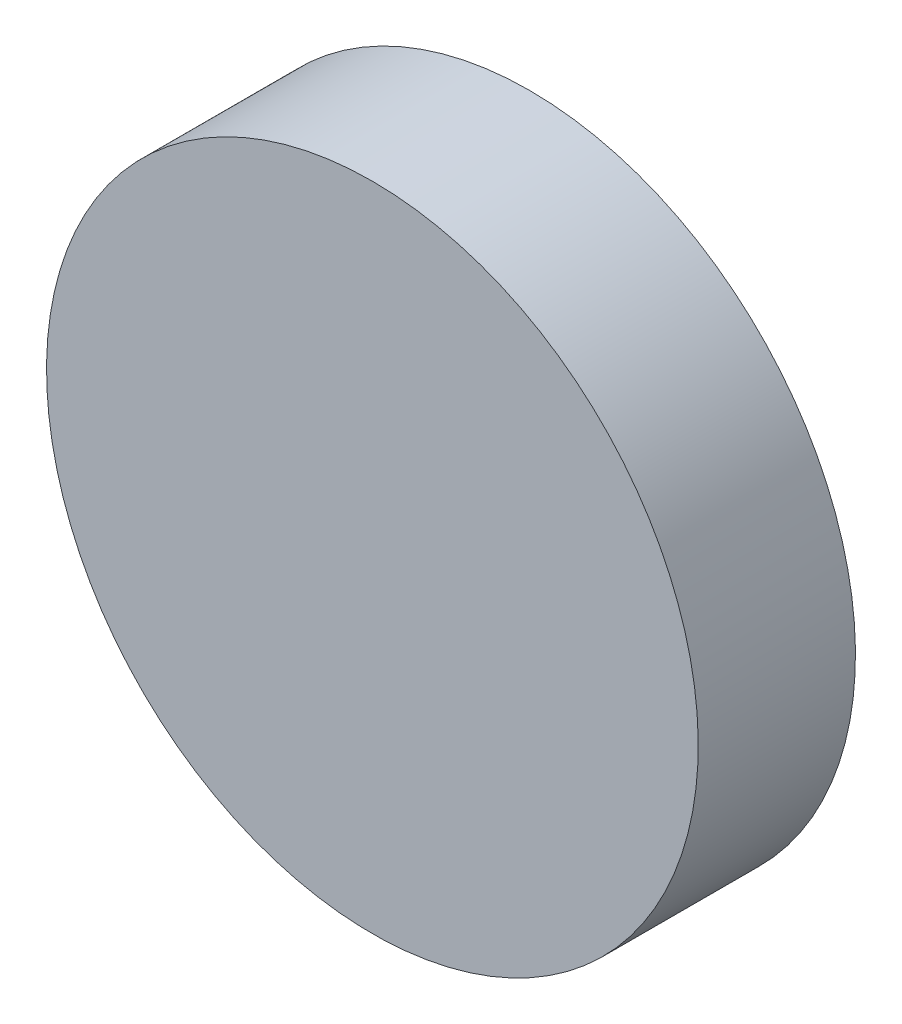
ISO-10303-21;
HEADER;
FILE_DESCRIPTION(('STEP AP214'),'2;1');
FILE_NAME('part.step','',(''),(''),'','','');
FILE_SCHEMA(('AUTOMOTIVE_DESIGN { 1 0 10303 214 1 1 1 1 }'));
ENDSEC;
DATA;
#1=APPLICATION_CONTEXT('core data for automotive mechanical design processes');
#2=APPLICATION_PROTOCOL_DEFINITION('international standard','automotive_design',2000,#1);
#3=PRODUCT_CONTEXT('',#1,'mechanical');
#4=PRODUCT('Part','Part','',(#3));
#5=PRODUCT_RELATED_PRODUCT_CATEGORY('part','',(#4));
#6=PRODUCT_DEFINITION_FORMATION('','',#4);
#7=PRODUCT_DEFINITION_CONTEXT('part definition',#1,'design');
#8=PRODUCT_DEFINITION('design','',#6,#7);
#9=PRODUCT_DEFINITION_SHAPE('','',#8);
#10=(LENGTH_UNIT() NAMED_UNIT(*) SI_UNIT(.MILLI.,.METRE.));
#11=(NAMED_UNIT(*) PLANE_ANGLE_UNIT() SI_UNIT($,.RADIAN.));
#12=(NAMED_UNIT(*) SI_UNIT($,.STERADIAN.) SOLID_ANGLE_UNIT());
#13=UNCERTAINTY_MEASURE_WITH_UNIT(LENGTH_MEASURE(1.E-05),#10,'distance_accuracy_value','');
#14=(GEOMETRIC_REPRESENTATION_CONTEXT(3) GLOBAL_UNCERTAINTY_ASSIGNED_CONTEXT((#13)) GLOBAL_UNIT_ASSIGNED_CONTEXT((#10,
#11,#12)) REPRESENTATION_CONTEXT('',''));
#15=CARTESIAN_POINT('',(0.,0.,0.));
#16=DIRECTION('',(0.,0.,1.));
#17=DIRECTION('',(1.,0.,0.));
#18=AXIS2_PLACEMENT_3D('',#15,#16,#17);
#19=CARTESIAN_POINT('',(0.,0.,-6.5));
#20=DIRECTION('',(0.,0.,-1.));
#21=DIRECTION('',(0.,1.,0.));
#22=AXIS2_PLACEMENT_3D('',#19,#20,#21);
#23=CYLINDRICAL_SURFACE('',#22,40.);
#24=CARTESIAN_POINT('',(0.,0.,-6.5));
#25=DIRECTION('',(0.,0.,-1.));
#26=DIRECTION('',(0.,1.,0.));
#27=AXIS2_PLACEMENT_3D('',#24,#25,#26);
#28=CIRCLE('',#27,40.);
#29=CARTESIAN_POINT('',(0.,40.,-6.5));
#30=VERTEX_POINT('',#29);
#31=EDGE_CURVE('E10',#30,#30,#28,.T.);
#32=ORIENTED_EDGE('',*,*,#31,.T.);
#33=EDGE_LOOP('',(#32));
#34=FACE_BOUND('',#33,.T.);
#35=CARTESIAN_POINT('',(0.,0.,-25.8));
#36=DIRECTION('',(0.,0.,-1.));
#37=DIRECTION('',(0.,1.,0.));
#38=AXIS2_PLACEMENT_3D('',#35,#36,#37);
#39=CIRCLE('',#38,40.);
#40=CARTESIAN_POINT('',(0.,40.,-25.8));
#41=VERTEX_POINT('',#40);
#42=EDGE_CURVE('E37',#41,#41,#39,.T.);
#43=ORIENTED_EDGE('',*,*,#42,.F.);
#44=EDGE_LOOP('',(#43));
#45=FACE_BOUND('',#44,.T.);
#46=ADVANCED_FACE('F31',(#34,#45),#23,.T.);
#47=CARTESIAN_POINT('',(40.,0.,-6.5));
#48=DIRECTION('',(0.,0.,1.));
#49=DIRECTION('',(0.,-1.,0.));
#50=AXIS2_PLACEMENT_3D('',#47,#48,#49);
#51=PLANE('',#50);
#52=ORIENTED_EDGE('',*,*,#31,.F.);
#53=EDGE_LOOP('',(#52));
#54=FACE_BOUND('',#53,.T.);
#55=ADVANCED_FACE('F46',(#54),#51,.T.);
#56=CARTESIAN_POINT('',(0.,0.,-25.8));
#57=DIRECTION('',(0.,0.,-1.));
#58=DIRECTION('',(0.,1.,0.));
#59=AXIS2_PLACEMENT_3D('',#56,#57,#58);
#60=PLANE('',#59);
#61=ORIENTED_EDGE('',*,*,#42,.T.);
#62=EDGE_LOOP('',(#61));
#63=FACE_BOUND('',#62,.T.);
#64=ADVANCED_FACE('F43',(#63),#60,.T.);
#65=CLOSED_SHELL('',(#46,#55,#64));
#66=MANIFOLD_SOLID_BREP('B2',#65);
#67=ADVANCED_BREP_SHAPE_REPRESENTATION('',(#18,#66),#14);
#68=SHAPE_DEFINITION_REPRESENTATION(#9,#67);
ENDSEC;
END-ISO-10303-21;
